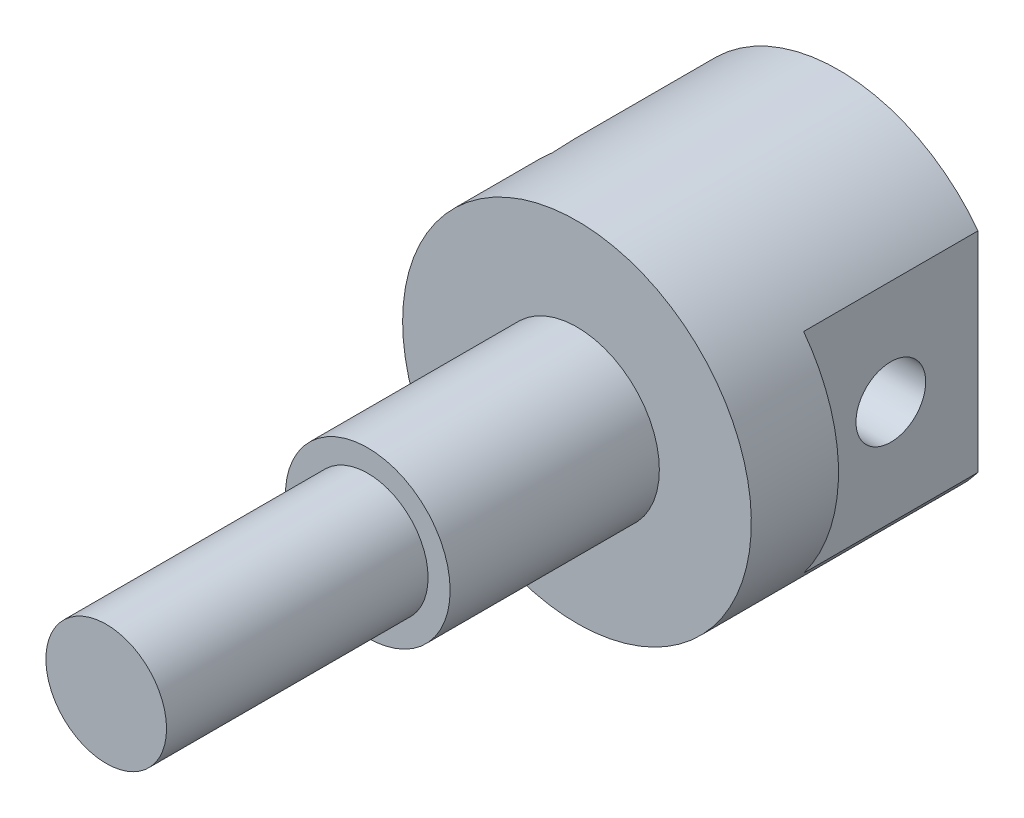
ISO-10303-21;
HEADER;
FILE_DESCRIPTION(('STEP AP214'),'2;1');
FILE_NAME('part.step','',(''),(''),'','','');
FILE_SCHEMA(('AUTOMOTIVE_DESIGN { 1 0 10303 214 1 1 1 1 }'));
ENDSEC;
DATA;
#1=APPLICATION_CONTEXT('core data for automotive mechanical design processes');
#2=APPLICATION_PROTOCOL_DEFINITION('international standard','automotive_design',2000,#1);
#3=PRODUCT_CONTEXT('',#1,'mechanical');
#4=PRODUCT('Part','Part','',(#3));
#5=PRODUCT_RELATED_PRODUCT_CATEGORY('part','',(#4));
#6=PRODUCT_DEFINITION_FORMATION('','',#4);
#7=PRODUCT_DEFINITION_CONTEXT('part definition',#1,'design');
#8=PRODUCT_DEFINITION('design','',#6,#7);
#9=PRODUCT_DEFINITION_SHAPE('','',#8);
#10=(LENGTH_UNIT() NAMED_UNIT(*) SI_UNIT(.MILLI.,.METRE.));
#11=(NAMED_UNIT(*) PLANE_ANGLE_UNIT() SI_UNIT($,.RADIAN.));
#12=(NAMED_UNIT(*) SI_UNIT($,.STERADIAN.) SOLID_ANGLE_UNIT());
#13=UNCERTAINTY_MEASURE_WITH_UNIT(LENGTH_MEASURE(1.E-05),#10,'distance_accuracy_value','');
#14=(GEOMETRIC_REPRESENTATION_CONTEXT(3) GLOBAL_UNCERTAINTY_ASSIGNED_CONTEXT((#13)) GLOBAL_UNIT_ASSIGNED_CONTEXT((#10,
#11,#12)) REPRESENTATION_CONTEXT('',''));
#15=CARTESIAN_POINT('',(0.,0.,0.));
#16=DIRECTION('',(0.,0.,1.));
#17=DIRECTION('',(1.,0.,0.));
#18=AXIS2_PLACEMENT_3D('',#15,#16,#17);
#19=CARTESIAN_POINT('',(0.,0.,-27.));
#20=DIRECTION('',(0.,0.,1.));
#21=DIRECTION('',(1.,0.,0.));
#22=AXIS2_PLACEMENT_3D('',#19,#20,#21);
#23=CYLINDRICAL_SURFACE('',#22,10.);
#24=CARTESIAN_POINT('',(0.,0.,-12.));
#25=DIRECTION('',(0.,0.,-1.));
#26=DIRECTION('',(-1.,0.,0.));
#27=AXIS2_PLACEMENT_3D('',#24,#25,#26);
#28=CIRCLE('',#27,10.);
#29=CARTESIAN_POINT('',(-10.,0.,-12.));
#30=VERTEX_POINT('',#29);
#31=EDGE_CURVE('E115',#30,#30,#28,.T.);
#32=ORIENTED_EDGE('',*,*,#31,.T.);
#33=EDGE_LOOP('',(#32));
#34=FACE_BOUND('',#33,.T.);
#35=CARTESIAN_POINT('',(0.,0.,-17.));
#36=DIRECTION('',(0.,0.,-1.));
#37=DIRECTION('',(0.,1.,0.));
#38=AXIS2_PLACEMENT_3D('',#35,#36,#37);
#39=CIRCLE('',#38,10.);
#40=CARTESIAN_POINT('',(8.,6.,-17.));
#41=VERTEX_POINT('',#40);
#42=CARTESIAN_POINT('',(8.,-6.,-17.));
#43=VERTEX_POINT('',#42);
#44=EDGE_CURVE('E11',#41,#43,#39,.T.);
#45=ORIENTED_EDGE('',*,*,#44,.F.);
#46=DIRECTION('',(0.,0.,-1.));
#47=VECTOR('',#46,1.);
#48=CARTESIAN_POINT('',(8.,6.,-4.83447493940356));
#49=LINE('',#48,#47);
#50=CARTESIAN_POINT('',(8.,6.,-27.));
#51=VERTEX_POINT('',#50);
#52=EDGE_CURVE('E92',#41,#51,#49,.T.);
#53=ORIENTED_EDGE('',*,*,#52,.T.);
#54=CARTESIAN_POINT('',(0.,0.,-27.));
#55=DIRECTION('',(0.,0.,-1.));
#56=DIRECTION('',(-1.,0.,0.));
#57=AXIS2_PLACEMENT_3D('',#54,#55,#56);
#58=CIRCLE('',#57,10.);
#59=CARTESIAN_POINT('',(-8.66025403784439,5.,-27.));
#60=VERTEX_POINT('',#59);
#61=EDGE_CURVE('E101',#60,#51,#58,.T.);
#62=ORIENTED_EDGE('',*,*,#61,.F.);
#63=CARTESIAN_POINT('',(0.,0.,-45.6602540378441));
#64=DIRECTION('',(0.,-0.965925826289067,0.258819045102525));
#65=DIRECTION('',(0.,0.258819045102525,0.965925826289067));
#66=AXIS2_PLACEMENT_3D('',#63,#64,#65);
#67=ELLIPSE('',#66,38.6370330515621,10.);
#68=CARTESIAN_POINT('',(-6.40510763254123,7.67949192431127,-17.));
#69=VERTEX_POINT('',#68);
#70=EDGE_CURVE('E118',#69,#60,#67,.T.);
#71=ORIENTED_EDGE('',*,*,#70,.F.);
#72=CARTESIAN_POINT('',(0.,0.,-17.));
#73=DIRECTION('',(0.,0.,-1.));
#74=DIRECTION('',(0.,1.,0.));
#75=AXIS2_PLACEMENT_3D('',#72,#73,#74);
#76=CIRCLE('',#75,10.);
#77=CARTESIAN_POINT('',(-6.40510763254123,-7.67949192431127,-17.));
#78=VERTEX_POINT('',#77);
#79=EDGE_CURVE('E45',#78,#69,#76,.T.);
#80=ORIENTED_EDGE('',*,*,#79,.F.);
#81=CARTESIAN_POINT('',(0.,0.,-45.6602540378441));
#82=DIRECTION('',(0.,0.965925826289067,0.258819045102525));
#83=DIRECTION('',(0.,-0.258819045102525,0.965925826289067));
#84=AXIS2_PLACEMENT_3D('',#81,#82,#83);
#85=ELLIPSE('',#84,38.6370330515621,10.);
#86=CARTESIAN_POINT('',(-8.66025403784439,-5.,-27.));
#87=VERTEX_POINT('',#86);
#88=EDGE_CURVE('E141',#87,#78,#85,.T.);
#89=ORIENTED_EDGE('',*,*,#88,.F.);
#90=CARTESIAN_POINT('',(8.,-6.,-27.));
#91=VERTEX_POINT('',#90);
#92=EDGE_CURVE('E110',#91,#87,#58,.T.);
#93=ORIENTED_EDGE('',*,*,#92,.F.);
#94=DIRECTION('',(0.,0.,-1.));
#95=VECTOR('',#94,1.);
#96=CARTESIAN_POINT('',(8.,-6.,-4.83447493940356));
#97=LINE('',#96,#95);
#98=EDGE_CURVE('E52',#43,#91,#97,.T.);
#99=ORIENTED_EDGE('',*,*,#98,.F.);
#100=EDGE_LOOP('',(#45,#53,#62,#71,#80,#89,#93,#99));
#101=FACE_BOUND('',#100,.T.);
#102=ADVANCED_FACE('F37',(#34,#101),#23,.T.);
#103=CARTESIAN_POINT('',(0.,0.,-27.));
#104=DIRECTION('',(0.,0.,-1.));
#105=DIRECTION('',(-1.,0.,0.));
#106=AXIS2_PLACEMENT_3D('',#103,#104,#105);
#107=PLANE('',#106);
#108=DIRECTION('',(0.,1.,0.));
#109=VECTOR('',#108,1.);
#110=CARTESIAN_POINT('',(8.,6.,-27.));
#111=LINE('',#110,#109);
#112=EDGE_CURVE('E89',#91,#51,#111,.T.);
#113=ORIENTED_EDGE('',*,*,#112,.F.);
#114=ORIENTED_EDGE('',*,*,#92,.T.);
#115=DIRECTION('',(-1.,0.,0.));
#116=VECTOR('',#115,1.);
#117=CARTESIAN_POINT('',(5.,-5.,-27.));
#118=LINE('',#117,#116);
#119=CARTESIAN_POINT('',(5.,-5.,-27.));
#120=VERTEX_POINT('',#119);
#121=EDGE_CURVE('E147',#120,#87,#118,.T.);
#122=ORIENTED_EDGE('',*,*,#121,.F.);
#123=DIRECTION('',(0.,1.,0.));
#124=VECTOR('',#123,1.);
#125=CARTESIAN_POINT('',(5.,-5.,-27.));
#126=LINE('',#125,#124);
#127=CARTESIAN_POINT('',(5.,5.,-27.));
#128=VERTEX_POINT('',#127);
#129=EDGE_CURVE('E150',#120,#128,#126,.T.);
#130=ORIENTED_EDGE('',*,*,#129,.T.);
#131=DIRECTION('',(-1.,0.,0.));
#132=VECTOR('',#131,1.);
#133=CARTESIAN_POINT('',(5.,5.,-27.));
#134=LINE('',#133,#132);
#135=EDGE_CURVE('E108',#128,#60,#134,.T.);
#136=ORIENTED_EDGE('',*,*,#135,.T.);
#137=ORIENTED_EDGE('',*,*,#61,.T.);
#138=EDGE_LOOP('',(#113,#114,#122,#130,#136,#137));
#139=FACE_BOUND('',#138,.T.);
#140=ADVANCED_FACE('F106',(#139),#107,.T.);
#141=CARTESIAN_POINT('',(0.,0.,-12.));
#142=DIRECTION('',(0.,0.,1.));
#143=DIRECTION('',(1.,0.,0.));
#144=AXIS2_PLACEMENT_3D('',#141,#142,#143);
#145=CYLINDRICAL_SURFACE('',#144,4.725);
#146=CARTESIAN_POINT('',(0.,0.,-12.));
#147=DIRECTION('',(0.,0.,1.));
#148=DIRECTION('',(1.,0.,0.));
#149=AXIS2_PLACEMENT_3D('',#146,#147,#148);
#150=CIRCLE('',#149,4.725);
#151=CARTESIAN_POINT('',(4.725,0.,-12.));
#152=VERTEX_POINT('',#151);
#153=EDGE_CURVE('E109',#152,#152,#150,.T.);
#154=ORIENTED_EDGE('',*,*,#153,.T.);
#155=EDGE_LOOP('',(#154));
#156=FACE_BOUND('',#155,.T.);
#157=CARTESIAN_POINT('',(0.,0.,0.));
#158=DIRECTION('',(0.,0.,1.));
#159=DIRECTION('',(1.,0.,0.));
#160=AXIS2_PLACEMENT_3D('',#157,#158,#159);
#161=CIRCLE('',#160,4.725);
#162=CARTESIAN_POINT('',(4.725,0.,0.));
#163=VERTEX_POINT('',#162);
#164=EDGE_CURVE('E124',#163,#163,#161,.T.);
#165=ORIENTED_EDGE('',*,*,#164,.F.);
#166=EDGE_LOOP('',(#165));
#167=FACE_BOUND('',#166,.T.);
#168=ADVANCED_FACE('F39',(#156,#167),#145,.T.);
#169=CARTESIAN_POINT('',(0.,0.,0.));
#170=DIRECTION('',(0.,0.,1.));
#171=DIRECTION('',(1.,0.,0.));
#172=AXIS2_PLACEMENT_3D('',#169,#170,#171);
#173=PLANE('',#172);
#174=CARTESIAN_POINT('',(0.,0.,0.));
#175=DIRECTION('',(0.,0.,1.));
#176=DIRECTION('',(1.,0.,0.));
#177=AXIS2_PLACEMENT_3D('',#174,#175,#176);
#178=CIRCLE('',#177,3.46);
#179=CARTESIAN_POINT('',(3.46,0.,0.));
#180=VERTEX_POINT('',#179);
#181=EDGE_CURVE('E125',#180,#180,#178,.T.);
#182=ORIENTED_EDGE('',*,*,#181,.F.);
#183=EDGE_LOOP('',(#182));
#184=FACE_BOUND('',#183,.T.);
#185=ORIENTED_EDGE('',*,*,#164,.T.);
#186=EDGE_LOOP('',(#185));
#187=FACE_BOUND('',#186,.T.);
#188=ADVANCED_FACE('F196',(#184,#187),#173,.T.);
#189=CARTESIAN_POINT('',(0.,0.,15.));
#190=DIRECTION('',(0.,0.,-1.));
#191=DIRECTION('',(-1.,0.,0.));
#192=AXIS2_PLACEMENT_3D('',#189,#190,#191);
#193=CYLINDRICAL_SURFACE('',#192,3.46);
#194=CARTESIAN_POINT('',(0.,0.,15.));
#195=DIRECTION('',(0.,0.,1.));
#196=DIRECTION('',(1.,0.,0.));
#197=AXIS2_PLACEMENT_3D('',#194,#195,#196);
#198=CIRCLE('',#197,3.46);
#199=CARTESIAN_POINT('',(3.46,0.,15.));
#200=VERTEX_POINT('',#199);
#201=EDGE_CURVE('E113',#200,#200,#198,.T.);
#202=ORIENTED_EDGE('',*,*,#201,.F.);
#203=EDGE_LOOP('',(#202));
#204=FACE_BOUND('',#203,.T.);
#205=ORIENTED_EDGE('',*,*,#181,.T.);
#206=EDGE_LOOP('',(#205));
#207=FACE_BOUND('',#206,.T.);
#208=ADVANCED_FACE('F193',(#204,#207),#193,.T.);
#209=CARTESIAN_POINT('',(0.,0.,15.));
#210=DIRECTION('',(0.,0.,1.));
#211=DIRECTION('',(1.,0.,0.));
#212=AXIS2_PLACEMENT_3D('',#209,#210,#211);
#213=PLANE('',#212);
#214=ORIENTED_EDGE('',*,*,#201,.T.);
#215=EDGE_LOOP('',(#214));
#216=FACE_BOUND('',#215,.T.);
#217=ADVANCED_FACE('F190',(#216),#213,.T.);
#218=CARTESIAN_POINT('',(0.,0.,-12.));
#219=DIRECTION('',(0.,0.,-1.));
#220=DIRECTION('',(-1.,0.,0.));
#221=AXIS2_PLACEMENT_3D('',#218,#219,#220);
#222=PLANE('',#221);
#223=ORIENTED_EDGE('',*,*,#153,.F.);
#224=EDGE_LOOP('',(#223));
#225=FACE_BOUND('',#224,.T.);
#226=ORIENTED_EDGE('',*,*,#31,.F.);
#227=EDGE_LOOP('',(#226));
#228=FACE_BOUND('',#227,.T.);
#229=ADVANCED_FACE('F189',(#225,#228),#222,.F.);
#230=CARTESIAN_POINT('',(5.,-7.67949192431127,-17.));
#231=DIRECTION('',(0.,0.,-1.));
#232=DIRECTION('',(0.,1.,0.));
#233=AXIS2_PLACEMENT_3D('',#230,#231,#232);
#234=PLANE('',#233);
#235=ORIENTED_EDGE('',*,*,#79,.T.);
#236=DIRECTION('',(-1.,0.,0.));
#237=VECTOR('',#236,1.);
#238=CARTESIAN_POINT('',(5.,7.67949192431127,-17.));
#239=LINE('',#238,#237);
#240=CARTESIAN_POINT('',(5.,7.67949192431127,-17.));
#241=VERTEX_POINT('',#240);
#242=EDGE_CURVE('E135',#241,#69,#239,.T.);
#243=ORIENTED_EDGE('',*,*,#242,.F.);
#244=DIRECTION('',(0.,-1.,0.));
#245=VECTOR('',#244,1.);
#246=CARTESIAN_POINT('',(5.,-7.67949192431127,-17.));
#247=LINE('',#246,#245);
#248=CARTESIAN_POINT('',(5.,-7.67949192431127,-17.));
#249=VERTEX_POINT('',#248);
#250=EDGE_CURVE('E154',#241,#249,#247,.T.);
#251=ORIENTED_EDGE('',*,*,#250,.T.);
#252=DIRECTION('',(-1.,0.,0.));
#253=VECTOR('',#252,1.);
#254=CARTESIAN_POINT('',(5.,-7.67949192431127,-17.));
#255=LINE('',#254,#253);
#256=EDGE_CURVE('E137',#249,#78,#255,.T.);
#257=ORIENTED_EDGE('',*,*,#256,.T.);
#258=EDGE_LOOP('',(#235,#243,#251,#257));
#259=FACE_BOUND('',#258,.T.);
#260=ADVANCED_FACE('F134',(#259),#234,.T.);
#261=CARTESIAN_POINT('',(5.,7.67949192431127,-17.));
#262=DIRECTION('',(0.,-0.965925826289067,0.258819045102525));
#263=DIRECTION('',(0.,-0.258819045102525,-0.965925826289067));
#264=AXIS2_PLACEMENT_3D('',#261,#262,#263);
#265=PLANE('',#264);
#266=ORIENTED_EDGE('',*,*,#70,.T.);
#267=ORIENTED_EDGE('',*,*,#135,.F.);
#268=DIRECTION('',(0.,0.258819045102525,0.965925826289067));
#269=VECTOR('',#268,1.);
#270=CARTESIAN_POINT('',(5.,7.67949192431127,-17.));
#271=LINE('',#270,#269);
#272=EDGE_CURVE('E60',#128,#241,#271,.T.);
#273=ORIENTED_EDGE('',*,*,#272,.T.);
#274=ORIENTED_EDGE('',*,*,#242,.T.);
#275=EDGE_LOOP('',(#266,#267,#273,#274));
#276=FACE_BOUND('',#275,.T.);
#277=ADVANCED_FACE('F140',(#276),#265,.T.);
#278=CARTESIAN_POINT('',(5.,-7.67949192431127,-17.));
#279=DIRECTION('',(0.,0.965925826289067,0.258819045102525));
#280=DIRECTION('',(0.,-0.258819045102525,0.965925826289067));
#281=AXIS2_PLACEMENT_3D('',#278,#279,#280);
#282=PLANE('',#281);
#283=ORIENTED_EDGE('',*,*,#88,.T.);
#284=ORIENTED_EDGE('',*,*,#256,.F.);
#285=DIRECTION('',(0.,0.258819045102525,-0.965925826289067));
#286=VECTOR('',#285,1.);
#287=CARTESIAN_POINT('',(5.,-7.67949192431127,-17.));
#288=LINE('',#287,#286);
#289=EDGE_CURVE('E152',#249,#120,#288,.T.);
#290=ORIENTED_EDGE('',*,*,#289,.T.);
#291=ORIENTED_EDGE('',*,*,#121,.T.);
#292=EDGE_LOOP('',(#283,#284,#290,#291));
#293=FACE_BOUND('',#292,.T.);
#294=ADVANCED_FACE('F223',(#293),#282,.T.);
#295=CARTESIAN_POINT('',(5.,0.,0.));
#296=DIRECTION('',(1.,0.,0.));
#297=DIRECTION('',(0.,0.,-1.));
#298=AXIS2_PLACEMENT_3D('',#295,#296,#297);
#299=PLANE('',#298);
#300=CARTESIAN_POINT('',(5.,0.,-22.));
#301=DIRECTION('',(1.,0.,0.));
#302=DIRECTION('',(0.,0.,-1.));
#303=AXIS2_PLACEMENT_3D('',#300,#301,#302);
#304=CIRCLE('',#303,2.);
#305=CARTESIAN_POINT('',(5.,0.,-24.));
#306=VERTEX_POINT('',#305);
#307=EDGE_CURVE('E96',#306,#306,#304,.F.);
#308=ORIENTED_EDGE('',*,*,#307,.F.);
#309=EDGE_LOOP('',(#308));
#310=FACE_BOUND('',#309,.T.);
#311=ORIENTED_EDGE('',*,*,#272,.F.);
#312=ORIENTED_EDGE('',*,*,#129,.F.);
#313=ORIENTED_EDGE('',*,*,#289,.F.);
#314=ORIENTED_EDGE('',*,*,#250,.F.);
#315=EDGE_LOOP('',(#311,#312,#313,#314));
#316=FACE_BOUND('',#315,.T.);
#317=ADVANCED_FACE('F176',(#310,#316),#299,.F.);
#318=CARTESIAN_POINT('',(5.,-7.67949192431127,-17.));
#319=DIRECTION('',(0.,0.,-1.));
#320=DIRECTION('',(0.,1.,0.));
#321=AXIS2_PLACEMENT_3D('',#318,#319,#320);
#322=PLANE('',#321);
#323=DIRECTION('',(0.,-1.,0.));
#324=VECTOR('',#323,1.);
#325=CARTESIAN_POINT('',(8.,6.,-17.));
#326=LINE('',#325,#324);
#327=EDGE_CURVE('E103',#41,#43,#326,.T.);
#328=ORIENTED_EDGE('',*,*,#327,.F.);
#329=ORIENTED_EDGE('',*,*,#44,.T.);
#330=EDGE_LOOP('',(#328,#329));
#331=FACE_BOUND('',#330,.T.);
#332=ADVANCED_FACE('F169',(#331),#322,.T.);
#333=CARTESIAN_POINT('',(8.,6.,-4.83447493940356));
#334=DIRECTION('',(-1.,0.,0.));
#335=DIRECTION('',(0.,0.,1.));
#336=AXIS2_PLACEMENT_3D('',#333,#334,#335);
#337=PLANE('',#336);
#338=CARTESIAN_POINT('',(8.,0.,-22.));
#339=DIRECTION('',(1.,0.,0.));
#340=DIRECTION('',(0.,0.,-1.));
#341=AXIS2_PLACEMENT_3D('',#338,#339,#340);
#342=CIRCLE('',#341,2.);
#343=CARTESIAN_POINT('',(8.,0.,-24.));
#344=VERTEX_POINT('',#343);
#345=EDGE_CURVE('E161',#344,#344,#342,.T.);
#346=ORIENTED_EDGE('',*,*,#345,.F.);
#347=EDGE_LOOP('',(#346));
#348=FACE_BOUND('',#347,.T.);
#349=ORIENTED_EDGE('',*,*,#327,.T.);
#350=ORIENTED_EDGE('',*,*,#98,.T.);
#351=ORIENTED_EDGE('',*,*,#112,.T.);
#352=ORIENTED_EDGE('',*,*,#52,.F.);
#353=EDGE_LOOP('',(#349,#350,#351,#352));
#354=FACE_BOUND('',#353,.T.);
#355=ADVANCED_FACE('F91',(#348,#354),#337,.F.);
#356=CARTESIAN_POINT('',(-10.001,0.,-22.));
#357=DIRECTION('',(1.,0.,0.));
#358=DIRECTION('',(0.,0.,-1.));
#359=AXIS2_PLACEMENT_3D('',#356,#357,#358);
#360=CYLINDRICAL_SURFACE('',#359,2.);
#361=ORIENTED_EDGE('',*,*,#345,.T.);
#362=EDGE_LOOP('',(#361));
#363=FACE_BOUND('',#362,.T.);
#364=ORIENTED_EDGE('',*,*,#307,.T.);
#365=EDGE_LOOP('',(#364));
#366=FACE_BOUND('',#365,.T.);
#367=ADVANCED_FACE('F165',(#363,#366),#360,.F.);
#368=CLOSED_SHELL('',(#102,#140,#168,#188,#208,#217,#229,#260,#277,#294,#317,#332,#355,#367));
#369=MANIFOLD_SOLID_BREP('B2',#368);
#370=ADVANCED_BREP_SHAPE_REPRESENTATION('',(#18,#369),#14);
#371=SHAPE_DEFINITION_REPRESENTATION(#9,#370);
ENDSEC;
END-ISO-10303-21;
